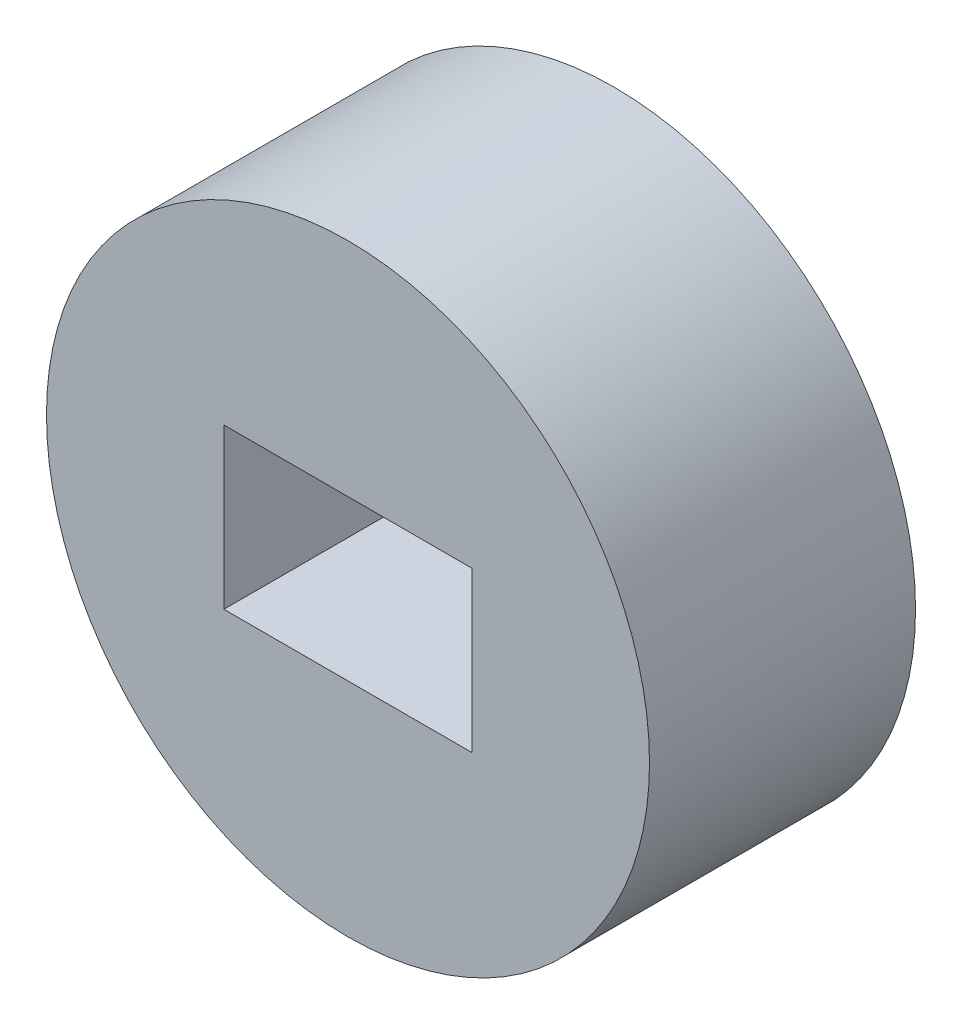
ISO-10303-21;
HEADER;
FILE_DESCRIPTION(('STEP AP214'),'2;1');
FILE_NAME('part.step','',(''),(''),'','','');
FILE_SCHEMA(('AUTOMOTIVE_DESIGN { 1 0 10303 214 1 1 1 1 }'));
ENDSEC;
DATA;
#1=APPLICATION_CONTEXT('core data for automotive mechanical design processes');
#2=APPLICATION_PROTOCOL_DEFINITION('international standard','automotive_design',2000,#1);
#3=PRODUCT_CONTEXT('',#1,'mechanical');
#4=PRODUCT('Part','Part','',(#3));
#5=PRODUCT_RELATED_PRODUCT_CATEGORY('part','',(#4));
#6=PRODUCT_DEFINITION_FORMATION('','',#4);
#7=PRODUCT_DEFINITION_CONTEXT('part definition',#1,'design');
#8=PRODUCT_DEFINITION('design','',#6,#7);
#9=PRODUCT_DEFINITION_SHAPE('','',#8);
#10=(LENGTH_UNIT() NAMED_UNIT(*) SI_UNIT(.MILLI.,.METRE.));
#11=(NAMED_UNIT(*) PLANE_ANGLE_UNIT() SI_UNIT($,.RADIAN.));
#12=(NAMED_UNIT(*) SI_UNIT($,.STERADIAN.) SOLID_ANGLE_UNIT());
#13=UNCERTAINTY_MEASURE_WITH_UNIT(LENGTH_MEASURE(1.E-05),#10,'distance_accuracy_value','');
#14=(GEOMETRIC_REPRESENTATION_CONTEXT(3) GLOBAL_UNCERTAINTY_ASSIGNED_CONTEXT((#13)) GLOBAL_UNIT_ASSIGNED_CONTEXT((#10,
#11,#12)) REPRESENTATION_CONTEXT('',''));
#15=CARTESIAN_POINT('',(0.,0.,0.));
#16=DIRECTION('',(0.,0.,1.));
#17=DIRECTION('',(1.,0.,0.));
#18=AXIS2_PLACEMENT_3D('',#15,#16,#17);
#19=CARTESIAN_POINT('',(12.8697255032,293.5514692216,3.));
#20=DIRECTION('',(0.,0.,1.));
#21=DIRECTION('',(1.,0.,0.));
#22=AXIS2_PLACEMENT_3D('',#19,#20,#21);
#23=PLANE('',#22);
#24=CARTESIAN_POINT('',(12.8697255032,293.5514692216,3.));
#25=DIRECTION('',(0.,0.,1.));
#26=DIRECTION('',(1.,0.,0.));
#27=AXIS2_PLACEMENT_3D('',#24,#25,#26);
#28=CIRCLE('',#27,3.4);
#29=CARTESIAN_POINT('',(16.2697255032,293.5514692216,3.));
#30=VERTEX_POINT('',#29);
#31=EDGE_CURVE('E11',#30,#30,#28,.T.);
#32=ORIENTED_EDGE('',*,*,#31,.T.);
#33=EDGE_LOOP('',(#32));
#34=FACE_BOUND('',#33,.T.);
#35=DIRECTION('',(0.,-1.,0.));
#36=VECTOR('',#35,1.);
#37=CARTESIAN_POINT('',(11.4697255032,294.4514692216,3.));
#38=LINE('',#37,#36);
#39=CARTESIAN_POINT('',(11.4697255032,294.4514692216,3.));
#40=VERTEX_POINT('',#39);
#41=CARTESIAN_POINT('',(11.4697255032,292.6514692216,3.));
#42=VERTEX_POINT('',#41);
#43=EDGE_CURVE('E82',#40,#42,#38,.T.);
#44=ORIENTED_EDGE('',*,*,#43,.F.);
#45=DIRECTION('',(-1.,0.,0.));
#46=VECTOR('',#45,1.);
#47=CARTESIAN_POINT('',(14.2697255032,294.4514692216,3.));
#48=LINE('',#47,#46);
#49=CARTESIAN_POINT('',(14.2697255032,294.4514692216,3.));
#50=VERTEX_POINT('',#49);
#51=EDGE_CURVE('E74',#50,#40,#48,.T.);
#52=ORIENTED_EDGE('',*,*,#51,.F.);
#53=DIRECTION('',(0.,1.,0.));
#54=VECTOR('',#53,1.);
#55=CARTESIAN_POINT('',(14.2697255032,292.6514692216,3.));
#56=LINE('',#55,#54);
#57=CARTESIAN_POINT('',(14.2697255032,292.6514692216,3.));
#58=VERTEX_POINT('',#57);
#59=EDGE_CURVE('E95',#58,#50,#56,.T.);
#60=ORIENTED_EDGE('',*,*,#59,.F.);
#61=DIRECTION('',(1.,0.,0.));
#62=VECTOR('',#61,1.);
#63=CARTESIAN_POINT('',(11.4697255032,292.6514692216,3.));
#64=LINE('',#63,#62);
#65=EDGE_CURVE('E93',#42,#58,#64,.T.);
#66=ORIENTED_EDGE('',*,*,#65,.F.);
#67=EDGE_LOOP('',(#44,#52,#60,#66));
#68=FACE_BOUND('',#67,.T.);
#69=ADVANCED_FACE('F33',(#34,#68),#23,.T.);
#70=CARTESIAN_POINT('',(12.8697255032,293.5514692216,0.));
#71=DIRECTION('',(0.,0.,1.));
#72=DIRECTION('',(1.,0.,0.));
#73=AXIS2_PLACEMENT_3D('',#70,#71,#72);
#74=PLANE('',#73);
#75=CARTESIAN_POINT('',(12.8697255032,293.5514692216,0.));
#76=DIRECTION('',(0.,0.,1.));
#77=DIRECTION('',(1.,0.,0.));
#78=AXIS2_PLACEMENT_3D('',#75,#76,#77);
#79=CIRCLE('',#78,3.4);
#80=CARTESIAN_POINT('',(16.2697255032,293.5514692216,0.));
#81=VERTEX_POINT('',#80);
#82=EDGE_CURVE('E37',#81,#81,#79,.T.);
#83=ORIENTED_EDGE('',*,*,#82,.F.);
#84=EDGE_LOOP('',(#83));
#85=FACE_BOUND('',#84,.T.);
#86=DIRECTION('',(-1.,0.,0.));
#87=VECTOR('',#86,1.);
#88=CARTESIAN_POINT('',(14.2697255032,294.4514692216,0.));
#89=LINE('',#88,#87);
#90=CARTESIAN_POINT('',(14.2697255032,294.4514692216,0.));
#91=VERTEX_POINT('',#90);
#92=CARTESIAN_POINT('',(11.4697255032,294.4514692216,0.));
#93=VERTEX_POINT('',#92);
#94=EDGE_CURVE('E56',#91,#93,#89,.T.);
#95=ORIENTED_EDGE('',*,*,#94,.T.);
#96=DIRECTION('',(0.,-1.,0.));
#97=VECTOR('',#96,1.);
#98=CARTESIAN_POINT('',(11.4697255032,294.4514692216,0.));
#99=LINE('',#98,#97);
#100=CARTESIAN_POINT('',(11.4697255032,292.6514692216,0.));
#101=VERTEX_POINT('',#100);
#102=EDGE_CURVE('E89',#93,#101,#99,.T.);
#103=ORIENTED_EDGE('',*,*,#102,.T.);
#104=DIRECTION('',(1.,0.,0.));
#105=VECTOR('',#104,1.);
#106=CARTESIAN_POINT('',(11.4697255032,292.6514692216,0.));
#107=LINE('',#106,#105);
#108=CARTESIAN_POINT('',(14.2697255032,292.6514692216,0.));
#109=VERTEX_POINT('',#108);
#110=EDGE_CURVE('E101',#101,#109,#107,.T.);
#111=ORIENTED_EDGE('',*,*,#110,.T.);
#112=DIRECTION('',(0.,1.,0.));
#113=VECTOR('',#112,1.);
#114=CARTESIAN_POINT('',(14.2697255032,292.6514692216,0.));
#115=LINE('',#114,#113);
#116=EDGE_CURVE('E83',#109,#91,#115,.T.);
#117=ORIENTED_EDGE('',*,*,#116,.T.);
#118=EDGE_LOOP('',(#95,#103,#111,#117));
#119=FACE_BOUND('',#118,.T.);
#120=ADVANCED_FACE('F112',(#85,#119),#74,.F.);
#121=CARTESIAN_POINT('',(12.8697255032,293.5514692216,3.));
#122=DIRECTION('',(0.,0.,-1.));
#123=DIRECTION('',(-1.,0.,0.));
#124=AXIS2_PLACEMENT_3D('',#121,#122,#123);
#125=CYLINDRICAL_SURFACE('',#124,3.4);
#126=ORIENTED_EDGE('',*,*,#31,.F.);
#127=EDGE_LOOP('',(#126));
#128=FACE_BOUND('',#127,.T.);
#129=ORIENTED_EDGE('',*,*,#82,.T.);
#130=EDGE_LOOP('',(#129));
#131=FACE_BOUND('',#130,.T.);
#132=ADVANCED_FACE('F35',(#128,#131),#125,.T.);
#133=CARTESIAN_POINT('',(14.2697255032,294.4514692216,3.));
#134=DIRECTION('',(0.,-1.,0.));
#135=DIRECTION('',(0.,0.,-1.));
#136=AXIS2_PLACEMENT_3D('',#133,#134,#135);
#137=PLANE('',#136);
#138=ORIENTED_EDGE('',*,*,#94,.F.);
#139=DIRECTION('',(0.,0.,-1.));
#140=VECTOR('',#139,1.);
#141=CARTESIAN_POINT('',(14.2697255032,294.4514692216,3.));
#142=LINE('',#141,#140);
#143=EDGE_CURVE('E78',#50,#91,#142,.T.);
#144=ORIENTED_EDGE('',*,*,#143,.F.);
#145=ORIENTED_EDGE('',*,*,#51,.T.);
#146=DIRECTION('',(0.,0.,-1.));
#147=VECTOR('',#146,1.);
#148=CARTESIAN_POINT('',(11.4697255032,294.4514692216,3.));
#149=LINE('',#148,#147);
#150=EDGE_CURVE('E77',#40,#93,#149,.T.);
#151=ORIENTED_EDGE('',*,*,#150,.T.);
#152=EDGE_LOOP('',(#138,#144,#145,#151));
#153=FACE_BOUND('',#152,.T.);
#154=ADVANCED_FACE('F76',(#153),#137,.T.);
#155=CARTESIAN_POINT('',(11.4697255032,294.4514692216,3.));
#156=DIRECTION('',(1.,0.,0.));
#157=DIRECTION('',(0.,0.,-1.));
#158=AXIS2_PLACEMENT_3D('',#155,#156,#157);
#159=PLANE('',#158);
#160=ORIENTED_EDGE('',*,*,#102,.F.);
#161=ORIENTED_EDGE('',*,*,#150,.F.);
#162=ORIENTED_EDGE('',*,*,#43,.T.);
#163=DIRECTION('',(0.,0.,-1.));
#164=VECTOR('',#163,1.);
#165=CARTESIAN_POINT('',(11.4697255032,292.6514692216,3.));
#166=LINE('',#165,#164);
#167=EDGE_CURVE('E90',#42,#101,#166,.T.);
#168=ORIENTED_EDGE('',*,*,#167,.T.);
#169=EDGE_LOOP('',(#160,#161,#162,#168));
#170=FACE_BOUND('',#169,.T.);
#171=ADVANCED_FACE('F86',(#170),#159,.T.);
#172=CARTESIAN_POINT('',(11.4697255032,292.6514692216,3.));
#173=DIRECTION('',(0.,1.,0.));
#174=DIRECTION('',(0.,0.,1.));
#175=AXIS2_PLACEMENT_3D('',#172,#173,#174);
#176=PLANE('',#175);
#177=ORIENTED_EDGE('',*,*,#110,.F.);
#178=ORIENTED_EDGE('',*,*,#167,.F.);
#179=ORIENTED_EDGE('',*,*,#65,.T.);
#180=DIRECTION('',(0.,0.,-1.));
#181=VECTOR('',#180,1.);
#182=CARTESIAN_POINT('',(14.2697255032,292.6514692216,3.));
#183=LINE('',#182,#181);
#184=EDGE_CURVE('E48',#58,#109,#183,.T.);
#185=ORIENTED_EDGE('',*,*,#184,.T.);
#186=EDGE_LOOP('',(#177,#178,#179,#185));
#187=FACE_BOUND('',#186,.T.);
#188=ADVANCED_FACE('F110',(#187),#176,.T.);
#189=CARTESIAN_POINT('',(14.2697255032,292.6514692216,3.));
#190=DIRECTION('',(-1.,0.,0.));
#191=DIRECTION('',(0.,0.,1.));
#192=AXIS2_PLACEMENT_3D('',#189,#190,#191);
#193=PLANE('',#192);
#194=ORIENTED_EDGE('',*,*,#116,.F.);
#195=ORIENTED_EDGE('',*,*,#184,.F.);
#196=ORIENTED_EDGE('',*,*,#59,.T.);
#197=ORIENTED_EDGE('',*,*,#143,.T.);
#198=EDGE_LOOP('',(#194,#195,#196,#197));
#199=FACE_BOUND('',#198,.T.);
#200=ADVANCED_FACE('F113',(#199),#193,.T.);
#201=CLOSED_SHELL('',(#69,#120,#132,#154,#171,#188,#200));
#202=MANIFOLD_SOLID_BREP('B2',#201);
#203=ADVANCED_BREP_SHAPE_REPRESENTATION('',(#18,#202),#14);
#204=SHAPE_DEFINITION_REPRESENTATION(#9,#203);
ENDSEC;
END-ISO-10303-21;
